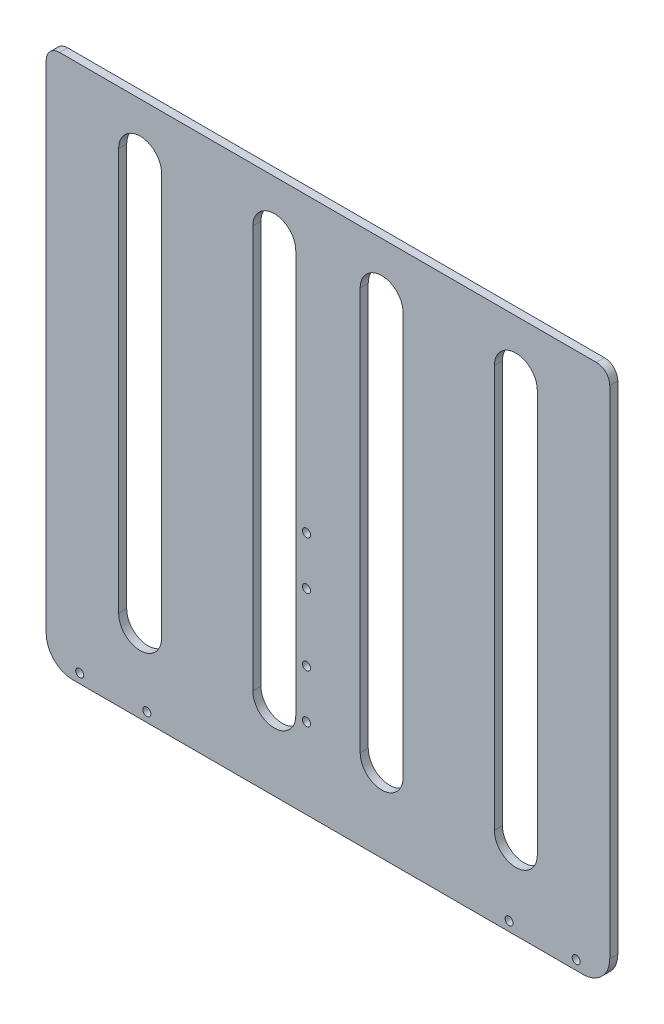
ISO-10303-21;
HEADER;
FILE_DESCRIPTION(('STEP AP214'),'2;1');
FILE_NAME('part.step','',(''),(''),'','','');
FILE_SCHEMA(('AUTOMOTIVE_DESIGN { 1 0 10303 214 1 1 1 1 }'));
ENDSEC;
DATA;
#1=APPLICATION_CONTEXT('core data for automotive mechanical design processes');
#2=APPLICATION_PROTOCOL_DEFINITION('international standard','automotive_design',2000,#1);
#3=PRODUCT_CONTEXT('',#1,'mechanical');
#4=PRODUCT('Part','Part','',(#3));
#5=PRODUCT_RELATED_PRODUCT_CATEGORY('part','',(#4));
#6=PRODUCT_DEFINITION_FORMATION('','',#4);
#7=PRODUCT_DEFINITION_CONTEXT('part definition',#1,'design');
#8=PRODUCT_DEFINITION('design','',#6,#7);
#9=PRODUCT_DEFINITION_SHAPE('','',#8);
#10=(LENGTH_UNIT() NAMED_UNIT(*) SI_UNIT(.MILLI.,.METRE.));
#11=(NAMED_UNIT(*) PLANE_ANGLE_UNIT() SI_UNIT($,.RADIAN.));
#12=(NAMED_UNIT(*) SI_UNIT($,.STERADIAN.) SOLID_ANGLE_UNIT());
#13=UNCERTAINTY_MEASURE_WITH_UNIT(LENGTH_MEASURE(1.E-05),#10,'distance_accuracy_value','');
#14=(GEOMETRIC_REPRESENTATION_CONTEXT(3) GLOBAL_UNCERTAINTY_ASSIGNED_CONTEXT((#13)) GLOBAL_UNIT_ASSIGNED_CONTEXT((#10,
#11,#12)) REPRESENTATION_CONTEXT('',''));
#15=CARTESIAN_POINT('',(0.,0.,0.));
#16=DIRECTION('',(0.,0.,1.));
#17=DIRECTION('',(1.,0.,0.));
#18=AXIS2_PLACEMENT_3D('',#15,#16,#17);
#19=CARTESIAN_POINT('',(0.,0.,3.));
#20=DIRECTION('',(1.,0.,0.));
#21=DIRECTION('',(0.,0.,-1.));
#22=AXIS2_PLACEMENT_3D('',#19,#20,#21);
#23=PLANE('',#22);
#24=DIRECTION('',(0.,-1.,0.));
#25=VECTOR('',#24,1.);
#26=CARTESIAN_POINT('',(0.,0.,3.));
#27=LINE('',#26,#25);
#28=CARTESIAN_POINT('',(0.,195.,3.));
#29=VERTEX_POINT('',#28);
#30=CARTESIAN_POINT('',(0.,10.,3.));
#31=VERTEX_POINT('',#30);
#32=EDGE_CURVE('E395',#29,#31,#27,.T.);
#33=ORIENTED_EDGE('',*,*,#32,.F.);
#34=DIRECTION('',(0.,0.,-1.));
#35=VECTOR('',#34,1.);
#36=CARTESIAN_POINT('',(0.,195.,3.));
#37=LINE('',#36,#35);
#38=CARTESIAN_POINT('',(0.,195.,0.));
#39=VERTEX_POINT('',#38);
#40=EDGE_CURVE('E11',#29,#39,#37,.T.);
#41=ORIENTED_EDGE('',*,*,#40,.T.);
#42=DIRECTION('',(0.,-1.,0.));
#43=VECTOR('',#42,1.);
#44=CARTESIAN_POINT('',(0.,0.,0.));
#45=LINE('',#44,#43);
#46=CARTESIAN_POINT('',(0.,10.,0.));
#47=VERTEX_POINT('',#46);
#48=EDGE_CURVE('E258',#39,#47,#45,.T.);
#49=ORIENTED_EDGE('',*,*,#48,.T.);
#50=DIRECTION('',(0.,0.,-1.));
#51=VECTOR('',#50,1.);
#52=CARTESIAN_POINT('',(0.,10.,3.));
#53=LINE('',#52,#51);
#54=EDGE_CURVE('E445',#47,#31,#53,.F.);
#55=ORIENTED_EDGE('',*,*,#54,.T.);
#56=EDGE_LOOP('',(#33,#41,#49,#55));
#57=FACE_BOUND('',#56,.T.);
#58=ADVANCED_FACE('F39',(#57),#23,.F.);
#59=CARTESIAN_POINT('',(0.,0.,3.));
#60=DIRECTION('',(0.,1.,0.));
#61=DIRECTION('',(0.,0.,1.));
#62=AXIS2_PLACEMENT_3D('',#59,#60,#61);
#63=PLANE('',#62);
#64=DIRECTION('',(1.,0.,0.));
#65=VECTOR('',#64,1.);
#66=CARTESIAN_POINT('',(0.,0.,0.));
#67=LINE('',#66,#65);
#68=CARTESIAN_POINT('',(10.,0.,0.));
#69=VERTEX_POINT('',#68);
#70=CARTESIAN_POINT('',(200.,0.,0.));
#71=VERTEX_POINT('',#70);
#72=EDGE_CURVE('E412',#69,#71,#67,.T.);
#73=ORIENTED_EDGE('',*,*,#72,.T.);
#74=DIRECTION('',(0.,0.,-1.));
#75=VECTOR('',#74,1.);
#76=CARTESIAN_POINT('',(200.,0.,3.));
#77=LINE('',#76,#75);
#78=CARTESIAN_POINT('',(200.,0.,3.));
#79=VERTEX_POINT('',#78);
#80=EDGE_CURVE('E436',#71,#79,#77,.F.);
#81=ORIENTED_EDGE('',*,*,#80,.T.);
#82=DIRECTION('',(1.,0.,0.));
#83=VECTOR('',#82,1.);
#84=CARTESIAN_POINT('',(0.,0.,3.));
#85=LINE('',#84,#83);
#86=CARTESIAN_POINT('',(10.,0.,3.));
#87=VERTEX_POINT('',#86);
#88=EDGE_CURVE('E398',#87,#79,#85,.T.);
#89=ORIENTED_EDGE('',*,*,#88,.F.);
#90=DIRECTION('',(0.,0.,-1.));
#91=VECTOR('',#90,1.);
#92=CARTESIAN_POINT('',(10.,0.,3.));
#93=LINE('',#92,#91);
#94=EDGE_CURVE('E432',#87,#69,#93,.T.);
#95=ORIENTED_EDGE('',*,*,#94,.T.);
#96=EDGE_LOOP('',(#73,#81,#89,#95));
#97=FACE_BOUND('',#96,.T.);
#98=ADVANCED_FACE('F486',(#97),#63,.F.);
#99=CARTESIAN_POINT('',(210.,0.,3.));
#100=DIRECTION('',(-1.,0.,0.));
#101=DIRECTION('',(0.,0.,1.));
#102=AXIS2_PLACEMENT_3D('',#99,#100,#101);
#103=PLANE('',#102);
#104=DIRECTION('',(0.,1.,0.));
#105=VECTOR('',#104,1.);
#106=CARTESIAN_POINT('',(210.,0.,0.));
#107=LINE('',#106,#105);
#108=CARTESIAN_POINT('',(210.,10.,0.));
#109=VERTEX_POINT('',#108);
#110=CARTESIAN_POINT('',(210.,195.,0.));
#111=VERTEX_POINT('',#110);
#112=EDGE_CURVE('E416',#109,#111,#107,.T.);
#113=ORIENTED_EDGE('',*,*,#112,.T.);
#114=DIRECTION('',(0.,0.,-1.));
#115=VECTOR('',#114,1.);
#116=CARTESIAN_POINT('',(210.,195.,3.));
#117=LINE('',#116,#115);
#118=CARTESIAN_POINT('',(210.,195.,3.));
#119=VERTEX_POINT('',#118);
#120=EDGE_CURVE('E63',#111,#119,#117,.F.);
#121=ORIENTED_EDGE('',*,*,#120,.T.);
#122=DIRECTION('',(0.,1.,0.));
#123=VECTOR('',#122,1.);
#124=CARTESIAN_POINT('',(210.,0.,3.));
#125=LINE('',#124,#123);
#126=CARTESIAN_POINT('',(210.,10.,3.));
#127=VERTEX_POINT('',#126);
#128=EDGE_CURVE('E403',#127,#119,#125,.T.);
#129=ORIENTED_EDGE('',*,*,#128,.F.);
#130=DIRECTION('',(0.,0.,-1.));
#131=VECTOR('',#130,1.);
#132=CARTESIAN_POINT('',(210.,10.,3.));
#133=LINE('',#132,#131);
#134=EDGE_CURVE('E409',#127,#109,#133,.T.);
#135=ORIENTED_EDGE('',*,*,#134,.T.);
#136=EDGE_LOOP('',(#113,#121,#129,#135));
#137=FACE_BOUND('',#136,.T.);
#138=ADVANCED_FACE('F478',(#137),#103,.F.);
#139=CARTESIAN_POINT('',(0.,200.,3.));
#140=DIRECTION('',(0.,-1.,0.));
#141=DIRECTION('',(0.,0.,-1.));
#142=AXIS2_PLACEMENT_3D('',#139,#140,#141);
#143=PLANE('',#142);
#144=DIRECTION('',(-1.,0.,0.));
#145=VECTOR('',#144,1.);
#146=CARTESIAN_POINT('',(0.,200.,3.));
#147=LINE('',#146,#145);
#148=CARTESIAN_POINT('',(205.,200.,3.));
#149=VERTEX_POINT('',#148);
#150=CARTESIAN_POINT('',(5.,200.,3.));
#151=VERTEX_POINT('',#150);
#152=EDGE_CURVE('E406',#149,#151,#147,.T.);
#153=ORIENTED_EDGE('',*,*,#152,.F.);
#154=DIRECTION('',(0.,0.,-1.));
#155=VECTOR('',#154,1.);
#156=CARTESIAN_POINT('',(205.,200.,3.));
#157=LINE('',#156,#155);
#158=CARTESIAN_POINT('',(205.,200.,0.));
#159=VERTEX_POINT('',#158);
#160=EDGE_CURVE('E452',#149,#159,#157,.T.);
#161=ORIENTED_EDGE('',*,*,#160,.T.);
#162=DIRECTION('',(-1.,0.,0.));
#163=VECTOR('',#162,1.);
#164=CARTESIAN_POINT('',(0.,200.,0.));
#165=LINE('',#164,#163);
#166=CARTESIAN_POINT('',(5.,200.,0.));
#167=VERTEX_POINT('',#166);
#168=EDGE_CURVE('E399',#159,#167,#165,.T.);
#169=ORIENTED_EDGE('',*,*,#168,.T.);
#170=DIRECTION('',(0.,0.,-1.));
#171=VECTOR('',#170,1.);
#172=CARTESIAN_POINT('',(5.,200.,3.));
#173=LINE('',#172,#171);
#174=EDGE_CURVE('E449',#167,#151,#173,.F.);
#175=ORIENTED_EDGE('',*,*,#174,.T.);
#176=EDGE_LOOP('',(#153,#161,#169,#175));
#177=FACE_BOUND('',#176,.T.);
#178=ADVANCED_FACE('F472',(#177),#143,.F.);
#179=CARTESIAN_POINT('',(0.,0.,3.));
#180=DIRECTION('',(0.,0.,-1.));
#181=DIRECTION('',(-1.,0.,0.));
#182=AXIS2_PLACEMENT_3D('',#179,#180,#181);
#183=PLANE('',#182);
#184=CARTESIAN_POINT('',(97.,91.,3.));
#185=DIRECTION('',(0.,0.,1.));
#186=DIRECTION('',(1.,0.,0.));
#187=AXIS2_PLACEMENT_3D('',#184,#185,#186);
#188=CIRCLE('',#187,1.5);
#189=CARTESIAN_POINT('',(98.5,91.,3.));
#190=VERTEX_POINT('',#189);
#191=EDGE_CURVE('E851',#190,#190,#188,.T.);
#192=ORIENTED_EDGE('',*,*,#191,.F.);
#193=EDGE_LOOP('',(#192));
#194=FACE_BOUND('',#193,.T.);
#195=CARTESIAN_POINT('',(97.,73.,3.));
#196=DIRECTION('',(0.,0.,1.));
#197=DIRECTION('',(1.,0.,0.));
#198=AXIS2_PLACEMENT_3D('',#195,#196,#197);
#199=CIRCLE('',#198,1.5);
#200=CARTESIAN_POINT('',(98.5,73.,3.));
#201=VERTEX_POINT('',#200);
#202=EDGE_CURVE('E855',#201,#201,#199,.T.);
#203=ORIENTED_EDGE('',*,*,#202,.F.);
#204=EDGE_LOOP('',(#203));
#205=FACE_BOUND('',#204,.T.);
#206=CARTESIAN_POINT('',(97.,30.,3.));
#207=DIRECTION('',(0.,0.,1.));
#208=DIRECTION('',(1.,0.,0.));
#209=AXIS2_PLACEMENT_3D('',#206,#207,#208);
#210=CIRCLE('',#209,1.49999999999998);
#211=CARTESIAN_POINT('',(98.5,30.,3.));
#212=VERTEX_POINT('',#211);
#213=EDGE_CURVE('E911',#212,#212,#210,.T.);
#214=ORIENTED_EDGE('',*,*,#213,.F.);
#215=EDGE_LOOP('',(#214));
#216=FACE_BOUND('',#215,.T.);
#217=CARTESIAN_POINT('',(97.,48.,3.));
#218=DIRECTION('',(0.,0.,1.));
#219=DIRECTION('',(1.,0.,0.));
#220=AXIS2_PLACEMENT_3D('',#217,#218,#219);
#221=CIRCLE('',#220,1.5);
#222=CARTESIAN_POINT('',(98.5,48.,3.));
#223=VERTEX_POINT('',#222);
#224=EDGE_CURVE('E864',#223,#223,#221,.T.);
#225=ORIENTED_EDGE('',*,*,#224,.F.);
#226=EDGE_LOOP('',(#225));
#227=FACE_BOUND('',#226,.T.);
#228=CARTESIAN_POINT('',(12.5,3.5,3.));
#229=DIRECTION('',(0.,0.,-1.));
#230=DIRECTION('',(-1.,0.,0.));
#231=AXIS2_PLACEMENT_3D('',#228,#229,#230);
#232=CIRCLE('',#231,1.5);
#233=CARTESIAN_POINT('',(11.,3.5,3.));
#234=VERTEX_POINT('',#233);
#235=EDGE_CURVE('E239',#234,#234,#232,.T.);
#236=ORIENTED_EDGE('',*,*,#235,.T.);
#237=EDGE_LOOP('',(#236));
#238=FACE_BOUND('',#237,.T.);
#239=CARTESIAN_POINT('',(37.5,3.49999999999998,3.));
#240=DIRECTION('',(0.,0.,-1.));
#241=DIRECTION('',(-1.,0.,0.));
#242=AXIS2_PLACEMENT_3D('',#239,#240,#241);
#243=CIRCLE('',#242,1.5);
#244=CARTESIAN_POINT('',(36.,3.49999999999998,3.));
#245=VERTEX_POINT('',#244);
#246=EDGE_CURVE('E891',#245,#245,#243,.T.);
#247=ORIENTED_EDGE('',*,*,#246,.T.);
#248=EDGE_LOOP('',(#247));
#249=FACE_BOUND('',#248,.T.);
#250=CARTESIAN_POINT('',(172.5,3.5,3.));
#251=DIRECTION('',(0.,0.,-1.));
#252=DIRECTION('',(-1.,0.,0.));
#253=AXIS2_PLACEMENT_3D('',#250,#251,#252);
#254=CIRCLE('',#253,1.5);
#255=CARTESIAN_POINT('',(171.,3.5,3.));
#256=VERTEX_POINT('',#255);
#257=EDGE_CURVE('E888',#256,#256,#254,.T.);
#258=ORIENTED_EDGE('',*,*,#257,.T.);
#259=EDGE_LOOP('',(#258));
#260=FACE_BOUND('',#259,.T.);
#261=CARTESIAN_POINT('',(197.5,3.50000000000001,3.));
#262=DIRECTION('',(0.,0.,-1.));
#263=DIRECTION('',(-1.,0.,0.));
#264=AXIS2_PLACEMENT_3D('',#261,#262,#263);
#265=CIRCLE('',#264,1.5);
#266=CARTESIAN_POINT('',(196.,3.50000000000001,3.));
#267=VERTEX_POINT('',#266);
#268=EDGE_CURVE('E873',#267,#267,#265,.T.);
#269=ORIENTED_EDGE('',*,*,#268,.T.);
#270=EDGE_LOOP('',(#269));
#271=FACE_BOUND('',#270,.T.);
#272=DIRECTION('',(0.,-1.,0.));
#273=VECTOR('',#272,1.);
#274=CARTESIAN_POINT('',(27.,180.,3.));
#275=LINE('',#274,#273);
#276=CARTESIAN_POINT('',(27.,180.,3.));
#277=VERTEX_POINT('',#276);
#278=CARTESIAN_POINT('',(27.,30.,3.));
#279=VERTEX_POINT('',#278);
#280=EDGE_CURVE('E248',#277,#279,#275,.T.);
#281=ORIENTED_EDGE('',*,*,#280,.F.);
#282=CARTESIAN_POINT('',(35.,180.,3.));
#283=DIRECTION('',(0.,0.,1.));
#284=DIRECTION('',(1.,0.,0.));
#285=AXIS2_PLACEMENT_3D('',#282,#283,#284);
#286=CIRCLE('',#285,8.00000000000001);
#287=CARTESIAN_POINT('',(43.,180.,3.));
#288=VERTEX_POINT('',#287);
#289=EDGE_CURVE('E211',#288,#277,#286,.T.);
#290=ORIENTED_EDGE('',*,*,#289,.F.);
#291=DIRECTION('',(0.,1.,0.));
#292=VECTOR('',#291,1.);
#293=CARTESIAN_POINT('',(43.,180.,3.));
#294=LINE('',#293,#292);
#295=CARTESIAN_POINT('',(43.,30.0000000000001,3.));
#296=VERTEX_POINT('',#295);
#297=EDGE_CURVE('E232',#296,#288,#294,.T.);
#298=ORIENTED_EDGE('',*,*,#297,.F.);
#299=CARTESIAN_POINT('',(35.,30.0000000000001,3.));
#300=DIRECTION('',(0.,0.,1.));
#301=DIRECTION('',(1.,0.,0.));
#302=AXIS2_PLACEMENT_3D('',#299,#300,#301);
#303=CIRCLE('',#302,7.99999999999999);
#304=EDGE_CURVE('E236',#279,#296,#303,.T.);
#305=ORIENTED_EDGE('',*,*,#304,.F.);
#306=EDGE_LOOP('',(#281,#290,#298,#305));
#307=FACE_BOUND('',#306,.T.);
#308=DIRECTION('',(0.,-1.,0.));
#309=VECTOR('',#308,1.);
#310=CARTESIAN_POINT('',(117.,180.,3.));
#311=LINE('',#310,#309);
#312=CARTESIAN_POINT('',(117.,180.,3.));
#313=VERTEX_POINT('',#312);
#314=CARTESIAN_POINT('',(117.,30.0000000000001,3.));
#315=VERTEX_POINT('',#314);
#316=EDGE_CURVE('E285',#313,#315,#311,.T.);
#317=ORIENTED_EDGE('',*,*,#316,.F.);
#318=CARTESIAN_POINT('',(125.,180.,3.));
#319=DIRECTION('',(0.,0.,1.));
#320=DIRECTION('',(-1.,0.,0.));
#321=AXIS2_PLACEMENT_3D('',#318,#319,#320);
#322=CIRCLE('',#321,8.00000000000001);
#323=CARTESIAN_POINT('',(133.,180.,3.));
#324=VERTEX_POINT('',#323);
#325=EDGE_CURVE('E282',#324,#313,#322,.T.);
#326=ORIENTED_EDGE('',*,*,#325,.F.);
#327=DIRECTION('',(0.,1.,0.));
#328=VECTOR('',#327,1.);
#329=CARTESIAN_POINT('',(133.,180.,3.));
#330=LINE('',#329,#328);
#331=CARTESIAN_POINT('',(133.,30.0000000000001,3.));
#332=VERTEX_POINT('',#331);
#333=EDGE_CURVE('E269',#332,#324,#330,.T.);
#334=ORIENTED_EDGE('',*,*,#333,.F.);
#335=CARTESIAN_POINT('',(125.,30.0000000000001,3.));
#336=DIRECTION('',(0.,0.,1.));
#337=DIRECTION('',(-1.,0.,0.));
#338=AXIS2_PLACEMENT_3D('',#335,#336,#337);
#339=CIRCLE('',#338,8.00000000000001);
#340=EDGE_CURVE('E289',#315,#332,#339,.T.);
#341=ORIENTED_EDGE('',*,*,#340,.F.);
#342=EDGE_LOOP('',(#317,#326,#334,#341));
#343=FACE_BOUND('',#342,.T.);
#344=DIRECTION('',(0.,-1.,0.));
#345=VECTOR('',#344,1.);
#346=CARTESIAN_POINT('',(77.,180.,3.));
#347=LINE('',#346,#345);
#348=CARTESIAN_POINT('',(77.,180.,3.));
#349=VERTEX_POINT('',#348);
#350=CARTESIAN_POINT('',(77.,30.0000000000001,3.));
#351=VERTEX_POINT('',#350);
#352=EDGE_CURVE('E373',#349,#351,#347,.T.);
#353=ORIENTED_EDGE('',*,*,#352,.F.);
#354=CARTESIAN_POINT('',(85.,180.,3.));
#355=DIRECTION('',(0.,0.,1.));
#356=DIRECTION('',(1.,0.,0.));
#357=AXIS2_PLACEMENT_3D('',#354,#355,#356);
#358=CIRCLE('',#357,8.00000000000001);
#359=CARTESIAN_POINT('',(93.,180.,3.));
#360=VERTEX_POINT('',#359);
#361=EDGE_CURVE('E299',#360,#349,#358,.T.);
#362=ORIENTED_EDGE('',*,*,#361,.F.);
#363=DIRECTION('',(0.,1.,0.));
#364=VECTOR('',#363,1.);
#365=CARTESIAN_POINT('',(93.,180.,3.));
#366=LINE('',#365,#364);
#367=CARTESIAN_POINT('',(93.,30.0000000000001,3.));
#368=VERTEX_POINT('',#367);
#369=EDGE_CURVE('E358',#368,#360,#366,.T.);
#370=ORIENTED_EDGE('',*,*,#369,.F.);
#371=CARTESIAN_POINT('',(85.,30.0000000000001,3.));
#372=DIRECTION('',(0.,0.,1.));
#373=DIRECTION('',(1.,0.,0.));
#374=AXIS2_PLACEMENT_3D('',#371,#372,#373);
#375=CIRCLE('',#374,8.00000000000001);
#376=EDGE_CURVE('E377',#351,#368,#375,.T.);
#377=ORIENTED_EDGE('',*,*,#376,.F.);
#378=EDGE_LOOP('',(#353,#362,#370,#377));
#379=FACE_BOUND('',#378,.T.);
#380=DIRECTION('',(0.,-1.,0.));
#381=VECTOR('',#380,1.);
#382=CARTESIAN_POINT('',(167.,180.,3.));
#383=LINE('',#382,#381);
#384=CARTESIAN_POINT('',(167.,180.,3.));
#385=VERTEX_POINT('',#384);
#386=CARTESIAN_POINT('',(167.,30.0000000000001,3.));
#387=VERTEX_POINT('',#386);
#388=EDGE_CURVE('E330',#385,#387,#383,.T.);
#389=ORIENTED_EDGE('',*,*,#388,.F.);
#390=CARTESIAN_POINT('',(175.,180.,3.));
#391=DIRECTION('',(0.,0.,1.));
#392=DIRECTION('',(-1.,0.,0.));
#393=AXIS2_PLACEMENT_3D('',#390,#391,#392);
#394=CIRCLE('',#393,8.00000000000001);
#395=CARTESIAN_POINT('',(183.,180.,3.));
#396=VERTEX_POINT('',#395);
#397=EDGE_CURVE('E327',#396,#385,#394,.T.);
#398=ORIENTED_EDGE('',*,*,#397,.F.);
#399=DIRECTION('',(0.,1.,0.));
#400=VECTOR('',#399,1.);
#401=CARTESIAN_POINT('',(183.,180.,3.));
#402=LINE('',#401,#400);
#403=CARTESIAN_POINT('',(183.,30.0000000000001,3.));
#404=VERTEX_POINT('',#403);
#405=EDGE_CURVE('E314',#404,#396,#402,.T.);
#406=ORIENTED_EDGE('',*,*,#405,.F.);
#407=CARTESIAN_POINT('',(175.,30.0000000000001,3.));
#408=DIRECTION('',(0.,0.,1.));
#409=DIRECTION('',(-1.,0.,0.));
#410=AXIS2_PLACEMENT_3D('',#407,#408,#409);
#411=CIRCLE('',#410,7.99999999999999);
#412=EDGE_CURVE('E335',#387,#404,#411,.T.);
#413=ORIENTED_EDGE('',*,*,#412,.F.);
#414=EDGE_LOOP('',(#389,#398,#406,#413));
#415=FACE_BOUND('',#414,.T.);
#416=ORIENTED_EDGE('',*,*,#128,.T.);
#417=CARTESIAN_POINT('',(205.,195.,3.));
#418=DIRECTION('',(0.,0.,-1.));
#419=DIRECTION('',(-1.,0.,0.));
#420=AXIS2_PLACEMENT_3D('',#417,#418,#419);
#421=CIRCLE('',#420,5.);
#422=EDGE_CURVE('E48',#119,#149,#421,.F.);
#423=ORIENTED_EDGE('',*,*,#422,.T.);
#424=ORIENTED_EDGE('',*,*,#152,.T.);
#425=CARTESIAN_POINT('',(5.,195.,3.));
#426=DIRECTION('',(0.,0.,-1.));
#427=DIRECTION('',(-1.,0.,0.));
#428=AXIS2_PLACEMENT_3D('',#425,#426,#427);
#429=CIRCLE('',#428,5.);
#430=EDGE_CURVE('E55',#151,#29,#429,.F.);
#431=ORIENTED_EDGE('',*,*,#430,.T.);
#432=ORIENTED_EDGE('',*,*,#32,.T.);
#433=CARTESIAN_POINT('',(10.,10.,3.));
#434=DIRECTION('',(0.,0.,-1.));
#435=DIRECTION('',(-1.,0.,0.));
#436=AXIS2_PLACEMENT_3D('',#433,#434,#435);
#437=CIRCLE('',#436,10.);
#438=EDGE_CURVE('E439',#31,#87,#437,.F.);
#439=ORIENTED_EDGE('',*,*,#438,.T.);
#440=ORIENTED_EDGE('',*,*,#88,.T.);
#441=CARTESIAN_POINT('',(200.,10.,3.));
#442=DIRECTION('',(0.,0.,-1.));
#443=DIRECTION('',(-1.,0.,0.));
#444=AXIS2_PLACEMENT_3D('',#441,#442,#443);
#445=CIRCLE('',#444,10.);
#446=EDGE_CURVE('E442',#79,#127,#445,.F.);
#447=ORIENTED_EDGE('',*,*,#446,.T.);
#448=EDGE_LOOP('',(#416,#423,#424,#431,#432,#439,#440,#447));
#449=FACE_BOUND('',#448,.T.);
#450=ADVANCED_FACE('F468',(#194,#205,#216,#227,#238,#249,#260,#271,#307,#343,#379,#415,#449),
#183,.F.);
#451=CARTESIAN_POINT('',(0.,0.,0.));
#452=DIRECTION('',(0.,0.,-1.));
#453=DIRECTION('',(-1.,0.,0.));
#454=AXIS2_PLACEMENT_3D('',#451,#452,#453);
#455=PLANE('',#454);
#456=CARTESIAN_POINT('',(97.,91.,0.));
#457=DIRECTION('',(0.,0.,1.));
#458=DIRECTION('',(1.,0.,0.));
#459=AXIS2_PLACEMENT_3D('',#456,#457,#458);
#460=CIRCLE('',#459,1.5);
#461=CARTESIAN_POINT('',(98.5,91.,0.));
#462=VERTEX_POINT('',#461);
#463=EDGE_CURVE('E848',#462,#462,#460,.T.);
#464=ORIENTED_EDGE('',*,*,#463,.T.);
#465=EDGE_LOOP('',(#464));
#466=FACE_BOUND('',#465,.T.);
#467=CARTESIAN_POINT('',(97.,73.,0.));
#468=DIRECTION('',(0.,0.,1.));
#469=DIRECTION('',(1.,0.,0.));
#470=AXIS2_PLACEMENT_3D('',#467,#468,#469);
#471=CIRCLE('',#470,1.5);
#472=CARTESIAN_POINT('',(98.5,73.,0.));
#473=VERTEX_POINT('',#472);
#474=EDGE_CURVE('E915',#473,#473,#471,.T.);
#475=ORIENTED_EDGE('',*,*,#474,.T.);
#476=EDGE_LOOP('',(#475));
#477=FACE_BOUND('',#476,.T.);
#478=CARTESIAN_POINT('',(97.,30.,0.));
#479=DIRECTION('',(0.,0.,1.));
#480=DIRECTION('',(1.,0.,0.));
#481=AXIS2_PLACEMENT_3D('',#478,#479,#480);
#482=CIRCLE('',#481,1.49999999999998);
#483=CARTESIAN_POINT('',(98.5,30.,0.));
#484=VERTEX_POINT('',#483);
#485=EDGE_CURVE('E868',#484,#484,#482,.T.);
#486=ORIENTED_EDGE('',*,*,#485,.T.);
#487=EDGE_LOOP('',(#486));
#488=FACE_BOUND('',#487,.T.);
#489=CARTESIAN_POINT('',(97.,48.,0.));
#490=DIRECTION('',(0.,0.,1.));
#491=DIRECTION('',(1.,0.,0.));
#492=AXIS2_PLACEMENT_3D('',#489,#490,#491);
#493=CIRCLE('',#492,1.5);
#494=CARTESIAN_POINT('',(98.5,48.,0.));
#495=VERTEX_POINT('',#494);
#496=EDGE_CURVE('E859',#495,#495,#493,.T.);
#497=ORIENTED_EDGE('',*,*,#496,.T.);
#498=EDGE_LOOP('',(#497));
#499=FACE_BOUND('',#498,.T.);
#500=CARTESIAN_POINT('',(12.5,3.5,0.));
#501=DIRECTION('',(0.,0.,1.));
#502=DIRECTION('',(1.,0.,0.));
#503=AXIS2_PLACEMENT_3D('',#500,#501,#502);
#504=CIRCLE('',#503,1.5);
#505=CARTESIAN_POINT('',(14.,3.5,0.));
#506=VERTEX_POINT('',#505);
#507=EDGE_CURVE('E869',#506,#506,#504,.T.);
#508=ORIENTED_EDGE('',*,*,#507,.T.);
#509=EDGE_LOOP('',(#508));
#510=FACE_BOUND('',#509,.T.);
#511=CARTESIAN_POINT('',(37.5,3.49999999999998,0.));
#512=DIRECTION('',(0.,0.,1.));
#513=DIRECTION('',(1.,0.,0.));
#514=AXIS2_PLACEMENT_3D('',#511,#512,#513);
#515=CIRCLE('',#514,1.5);
#516=CARTESIAN_POINT('',(39.,3.49999999999998,0.));
#517=VERTEX_POINT('',#516);
#518=EDGE_CURVE('E874',#517,#517,#515,.T.);
#519=ORIENTED_EDGE('',*,*,#518,.T.);
#520=EDGE_LOOP('',(#519));
#521=FACE_BOUND('',#520,.T.);
#522=CARTESIAN_POINT('',(172.5,3.5,0.));
#523=DIRECTION('',(0.,0.,1.));
#524=DIRECTION('',(-1.,0.,0.));
#525=AXIS2_PLACEMENT_3D('',#522,#523,#524);
#526=CIRCLE('',#525,1.5);
#527=CARTESIAN_POINT('',(171.,3.5,0.));
#528=VERTEX_POINT('',#527);
#529=EDGE_CURVE('E878',#528,#528,#526,.T.);
#530=ORIENTED_EDGE('',*,*,#529,.T.);
#531=EDGE_LOOP('',(#530));
#532=FACE_BOUND('',#531,.T.);
#533=CARTESIAN_POINT('',(197.5,3.50000000000001,0.));
#534=DIRECTION('',(0.,0.,1.));
#535=DIRECTION('',(-1.,0.,0.));
#536=AXIS2_PLACEMENT_3D('',#533,#534,#535);
#537=CIRCLE('',#536,1.5);
#538=CARTESIAN_POINT('',(196.,3.50000000000001,0.));
#539=VERTEX_POINT('',#538);
#540=EDGE_CURVE('E863',#539,#539,#537,.T.);
#541=ORIENTED_EDGE('',*,*,#540,.T.);
#542=EDGE_LOOP('',(#541));
#543=FACE_BOUND('',#542,.T.);
#544=CARTESIAN_POINT('',(35.,180.,0.));
#545=DIRECTION('',(0.,0.,1.));
#546=DIRECTION('',(1.,0.,0.));
#547=AXIS2_PLACEMENT_3D('',#544,#545,#546);
#548=CIRCLE('',#547,8.00000000000001);
#549=CARTESIAN_POINT('',(43.,180.,0.));
#550=VERTEX_POINT('',#549);
#551=CARTESIAN_POINT('',(27.,180.,0.));
#552=VERTEX_POINT('',#551);
#553=EDGE_CURVE('E208',#550,#552,#548,.T.);
#554=ORIENTED_EDGE('',*,*,#553,.T.);
#555=DIRECTION('',(0.,-1.,0.));
#556=VECTOR('',#555,1.);
#557=CARTESIAN_POINT('',(27.,180.,0.));
#558=LINE('',#557,#556);
#559=CARTESIAN_POINT('',(27.0000000000001,30.,0.));
#560=VERTEX_POINT('',#559);
#561=EDGE_CURVE('E221',#552,#560,#558,.T.);
#562=ORIENTED_EDGE('',*,*,#561,.T.);
#563=CARTESIAN_POINT('',(35.,30.0000000000001,0.));
#564=DIRECTION('',(0.,0.,1.));
#565=DIRECTION('',(1.,0.,0.));
#566=AXIS2_PLACEMENT_3D('',#563,#564,#565);
#567=CIRCLE('',#566,7.99999999999999);
#568=CARTESIAN_POINT('',(43.,30.0000000000001,0.));
#569=VERTEX_POINT('',#568);
#570=EDGE_CURVE('E226',#560,#569,#567,.T.);
#571=ORIENTED_EDGE('',*,*,#570,.T.);
#572=DIRECTION('',(0.,1.,0.));
#573=VECTOR('',#572,1.);
#574=CARTESIAN_POINT('',(43.,180.,0.));
#575=LINE('',#574,#573);
#576=EDGE_CURVE('E217',#569,#550,#575,.T.);
#577=ORIENTED_EDGE('',*,*,#576,.T.);
#578=EDGE_LOOP('',(#554,#562,#571,#577));
#579=FACE_BOUND('',#578,.T.);
#580=CARTESIAN_POINT('',(125.,180.,0.));
#581=DIRECTION('',(0.,0.,1.));
#582=DIRECTION('',(-1.,0.,0.));
#583=AXIS2_PLACEMENT_3D('',#580,#581,#582);
#584=CIRCLE('',#583,8.00000000000001);
#585=CARTESIAN_POINT('',(133.,180.,0.));
#586=VERTEX_POINT('',#585);
#587=CARTESIAN_POINT('',(117.,180.,0.));
#588=VERTEX_POINT('',#587);
#589=EDGE_CURVE('E264',#586,#588,#584,.T.);
#590=ORIENTED_EDGE('',*,*,#589,.T.);
#591=DIRECTION('',(0.,-1.,0.));
#592=VECTOR('',#591,1.);
#593=CARTESIAN_POINT('',(117.,180.,0.));
#594=LINE('',#593,#592);
#595=CARTESIAN_POINT('',(117.,30.0000000000001,0.));
#596=VERTEX_POINT('',#595);
#597=EDGE_CURVE('E268',#588,#596,#594,.T.);
#598=ORIENTED_EDGE('',*,*,#597,.T.);
#599=CARTESIAN_POINT('',(125.,30.0000000000001,0.));
#600=DIRECTION('',(0.,0.,1.));
#601=DIRECTION('',(-1.,0.,0.));
#602=AXIS2_PLACEMENT_3D('',#599,#600,#601);
#603=CIRCLE('',#602,8.00000000000001);
#604=CARTESIAN_POINT('',(133.,30.0000000000001,0.));
#605=VERTEX_POINT('',#604);
#606=EDGE_CURVE('E273',#596,#605,#603,.T.);
#607=ORIENTED_EDGE('',*,*,#606,.T.);
#608=DIRECTION('',(0.,1.,0.));
#609=VECTOR('',#608,1.);
#610=CARTESIAN_POINT('',(133.,180.,0.));
#611=LINE('',#610,#609);
#612=EDGE_CURVE('E277',#605,#586,#611,.T.);
#613=ORIENTED_EDGE('',*,*,#612,.T.);
#614=EDGE_LOOP('',(#590,#598,#607,#613));
#615=FACE_BOUND('',#614,.T.);
#616=CARTESIAN_POINT('',(85.,180.,0.));
#617=DIRECTION('',(0.,0.,1.));
#618=DIRECTION('',(1.,0.,0.));
#619=AXIS2_PLACEMENT_3D('',#616,#617,#618);
#620=CIRCLE('',#619,8.00000000000001);
#621=CARTESIAN_POINT('',(93.,180.,0.));
#622=VERTEX_POINT('',#621);
#623=CARTESIAN_POINT('',(77.,180.,0.));
#624=VERTEX_POINT('',#623);
#625=EDGE_CURVE('E353',#622,#624,#620,.T.);
#626=ORIENTED_EDGE('',*,*,#625,.T.);
#627=DIRECTION('',(0.,-1.,0.));
#628=VECTOR('',#627,1.);
#629=CARTESIAN_POINT('',(77.,180.,0.));
#630=LINE('',#629,#628);
#631=CARTESIAN_POINT('',(77.,30.0000000000001,0.));
#632=VERTEX_POINT('',#631);
#633=EDGE_CURVE('E357',#624,#632,#630,.T.);
#634=ORIENTED_EDGE('',*,*,#633,.T.);
#635=CARTESIAN_POINT('',(85.,30.0000000000001,0.));
#636=DIRECTION('',(0.,0.,1.));
#637=DIRECTION('',(1.,0.,0.));
#638=AXIS2_PLACEMENT_3D('',#635,#636,#637);
#639=CIRCLE('',#638,8.00000000000001);
#640=CARTESIAN_POINT('',(93.,30.0000000000001,0.));
#641=VERTEX_POINT('',#640);
#642=EDGE_CURVE('E362',#632,#641,#639,.T.);
#643=ORIENTED_EDGE('',*,*,#642,.T.);
#644=DIRECTION('',(0.,1.,0.));
#645=VECTOR('',#644,1.);
#646=CARTESIAN_POINT('',(93.,180.,0.));
#647=LINE('',#646,#645);
#648=EDGE_CURVE('E366',#641,#622,#647,.T.);
#649=ORIENTED_EDGE('',*,*,#648,.T.);
#650=EDGE_LOOP('',(#626,#634,#643,#649));
#651=FACE_BOUND('',#650,.T.);
#652=CARTESIAN_POINT('',(175.,180.,0.));
#653=DIRECTION('',(0.,0.,1.));
#654=DIRECTION('',(-1.,0.,0.));
#655=AXIS2_PLACEMENT_3D('',#652,#653,#654);
#656=CIRCLE('',#655,8.00000000000001);
#657=CARTESIAN_POINT('',(183.,180.,0.));
#658=VERTEX_POINT('',#657);
#659=CARTESIAN_POINT('',(167.,180.,0.));
#660=VERTEX_POINT('',#659);
#661=EDGE_CURVE('E309',#658,#660,#656,.T.);
#662=ORIENTED_EDGE('',*,*,#661,.T.);
#663=DIRECTION('',(0.,-1.,0.));
#664=VECTOR('',#663,1.);
#665=CARTESIAN_POINT('',(167.,180.,0.));
#666=LINE('',#665,#664);
#667=CARTESIAN_POINT('',(167.,30.0000000000001,0.));
#668=VERTEX_POINT('',#667);
#669=EDGE_CURVE('E313',#660,#668,#666,.T.);
#670=ORIENTED_EDGE('',*,*,#669,.T.);
#671=CARTESIAN_POINT('',(175.,30.0000000000001,0.));
#672=DIRECTION('',(0.,0.,1.));
#673=DIRECTION('',(-1.,0.,0.));
#674=AXIS2_PLACEMENT_3D('',#671,#672,#673);
#675=CIRCLE('',#674,7.99999999999999);
#676=CARTESIAN_POINT('',(183.,30.0000000000001,0.));
#677=VERTEX_POINT('',#676);
#678=EDGE_CURVE('E318',#668,#677,#675,.T.);
#679=ORIENTED_EDGE('',*,*,#678,.T.);
#680=DIRECTION('',(0.,1.,0.));
#681=VECTOR('',#680,1.);
#682=CARTESIAN_POINT('',(183.,180.,0.));
#683=LINE('',#682,#681);
#684=EDGE_CURVE('E322',#677,#658,#683,.T.);
#685=ORIENTED_EDGE('',*,*,#684,.T.);
#686=EDGE_LOOP('',(#662,#670,#679,#685));
#687=FACE_BOUND('',#686,.T.);
#688=ORIENTED_EDGE('',*,*,#168,.F.);
#689=CARTESIAN_POINT('',(205.,195.,0.));
#690=DIRECTION('',(0.,0.,-1.));
#691=DIRECTION('',(-1.,0.,0.));
#692=AXIS2_PLACEMENT_3D('',#689,#690,#691);
#693=CIRCLE('',#692,5.);
#694=EDGE_CURVE('E459',#159,#111,#693,.T.);
#695=ORIENTED_EDGE('',*,*,#694,.T.);
#696=ORIENTED_EDGE('',*,*,#112,.F.);
#697=CARTESIAN_POINT('',(200.,10.,0.));
#698=DIRECTION('',(0.,0.,-1.));
#699=DIRECTION('',(-1.,0.,0.));
#700=AXIS2_PLACEMENT_3D('',#697,#698,#699);
#701=CIRCLE('',#700,10.);
#702=EDGE_CURVE('E429',#109,#71,#701,.T.);
#703=ORIENTED_EDGE('',*,*,#702,.T.);
#704=ORIENTED_EDGE('',*,*,#72,.F.);
#705=CARTESIAN_POINT('',(10.,10.,0.));
#706=DIRECTION('',(0.,0.,-1.));
#707=DIRECTION('',(-1.,0.,0.));
#708=AXIS2_PLACEMENT_3D('',#705,#706,#707);
#709=CIRCLE('',#708,10.);
#710=EDGE_CURVE('E425',#69,#47,#709,.T.);
#711=ORIENTED_EDGE('',*,*,#710,.T.);
#712=ORIENTED_EDGE('',*,*,#48,.F.);
#713=CARTESIAN_POINT('',(5.,195.,0.));
#714=DIRECTION('',(0.,0.,-1.));
#715=DIRECTION('',(-1.,0.,0.));
#716=AXIS2_PLACEMENT_3D('',#713,#714,#715);
#717=CIRCLE('',#716,5.);
#718=EDGE_CURVE('E456',#39,#167,#717,.T.);
#719=ORIENTED_EDGE('',*,*,#718,.T.);
#720=EDGE_LOOP('',(#688,#695,#696,#703,#704,#711,#712,#719));
#721=FACE_BOUND('',#720,.T.);
#722=ADVANCED_FACE('F228',(#466,#477,#488,#499,#510,#521,#532,#543,#579,#615,#651,#687,#721),
#455,.T.);
#723=CARTESIAN_POINT('',(175.,180.,0.));
#724=DIRECTION('',(0.,0.,1.));
#725=DIRECTION('',(1.,0.,0.));
#726=AXIS2_PLACEMENT_3D('',#723,#724,#725);
#727=CYLINDRICAL_SURFACE('',#726,8.00000000000001);
#728=ORIENTED_EDGE('',*,*,#397,.T.);
#729=DIRECTION('',(0.,0.,1.));
#730=VECTOR('',#729,1.);
#731=CARTESIAN_POINT('',(167.,180.,0.));
#732=LINE('',#731,#730);
#733=EDGE_CURVE('E326',#660,#385,#732,.T.);
#734=ORIENTED_EDGE('',*,*,#733,.F.);
#735=ORIENTED_EDGE('',*,*,#661,.F.);
#736=DIRECTION('',(0.,0.,1.));
#737=VECTOR('',#736,1.);
#738=CARTESIAN_POINT('',(183.,180.,0.));
#739=LINE('',#738,#737);
#740=EDGE_CURVE('E249',#658,#396,#739,.T.);
#741=ORIENTED_EDGE('',*,*,#740,.T.);
#742=EDGE_LOOP('',(#728,#734,#735,#741));
#743=FACE_BOUND('',#742,.T.);
#744=ADVANCED_FACE('F591',(#743),#727,.F.);
#745=CARTESIAN_POINT('',(183.,180.,0.));
#746=DIRECTION('',(1.,0.,0.));
#747=DIRECTION('',(0.,0.,-1.));
#748=AXIS2_PLACEMENT_3D('',#745,#746,#747);
#749=PLANE('',#748);
#750=ORIENTED_EDGE('',*,*,#405,.T.);
#751=ORIENTED_EDGE('',*,*,#740,.F.);
#752=ORIENTED_EDGE('',*,*,#684,.F.);
#753=DIRECTION('',(0.,0.,1.));
#754=VECTOR('',#753,1.);
#755=CARTESIAN_POINT('',(183.,30.0000000000001,0.));
#756=LINE('',#755,#754);
#757=EDGE_CURVE('E344',#677,#404,#756,.T.);
#758=ORIENTED_EDGE('',*,*,#757,.T.);
#759=EDGE_LOOP('',(#750,#751,#752,#758));
#760=FACE_BOUND('',#759,.T.);
#761=ADVANCED_FACE('F666',(#760),#749,.F.);
#762=CARTESIAN_POINT('',(175.,30.0000000000001,0.));
#763=DIRECTION('',(0.,0.,1.));
#764=DIRECTION('',(1.,0.,0.));
#765=AXIS2_PLACEMENT_3D('',#762,#763,#764);
#766=CYLINDRICAL_SURFACE('',#765,7.99999999999999);
#767=ORIENTED_EDGE('',*,*,#412,.T.);
#768=ORIENTED_EDGE('',*,*,#757,.F.);
#769=ORIENTED_EDGE('',*,*,#678,.F.);
#770=DIRECTION('',(0.,0.,1.));
#771=VECTOR('',#770,1.);
#772=CARTESIAN_POINT('',(167.,30.0000000000001,0.));
#773=LINE('',#772,#771);
#774=EDGE_CURVE('E347',#668,#387,#773,.T.);
#775=ORIENTED_EDGE('',*,*,#774,.T.);
#776=EDGE_LOOP('',(#767,#768,#769,#775));
#777=FACE_BOUND('',#776,.T.);
#778=ADVANCED_FACE('F669',(#777),#766,.F.);
#779=CARTESIAN_POINT('',(167.,180.,0.));
#780=DIRECTION('',(-1.,0.,0.));
#781=DIRECTION('',(0.,-1.,0.));
#782=AXIS2_PLACEMENT_3D('',#779,#780,#781);
#783=PLANE('',#782);
#784=ORIENTED_EDGE('',*,*,#388,.T.);
#785=ORIENTED_EDGE('',*,*,#774,.F.);
#786=ORIENTED_EDGE('',*,*,#669,.F.);
#787=ORIENTED_EDGE('',*,*,#733,.T.);
#788=EDGE_LOOP('',(#784,#785,#786,#787));
#789=FACE_BOUND('',#788,.T.);
#790=ADVANCED_FACE('F673',(#789),#783,.F.);
#791=CARTESIAN_POINT('',(85.,180.,0.));
#792=DIRECTION('',(0.,0.,1.));
#793=DIRECTION('',(1.,0.,0.));
#794=AXIS2_PLACEMENT_3D('',#791,#792,#793);
#795=CYLINDRICAL_SURFACE('',#794,8.00000000000001);
#796=ORIENTED_EDGE('',*,*,#361,.T.);
#797=DIRECTION('',(0.,0.,1.));
#798=VECTOR('',#797,1.);
#799=CARTESIAN_POINT('',(77.,180.,0.));
#800=LINE('',#799,#798);
#801=EDGE_CURVE('E370',#624,#349,#800,.T.);
#802=ORIENTED_EDGE('',*,*,#801,.F.);
#803=ORIENTED_EDGE('',*,*,#625,.F.);
#804=DIRECTION('',(0.,0.,1.));
#805=VECTOR('',#804,1.);
#806=CARTESIAN_POINT('',(93.,180.,0.));
#807=LINE('',#806,#805);
#808=EDGE_CURVE('E331',#622,#360,#807,.T.);
#809=ORIENTED_EDGE('',*,*,#808,.T.);
#810=EDGE_LOOP('',(#796,#802,#803,#809));
#811=FACE_BOUND('',#810,.T.);
#812=ADVANCED_FACE('F677',(#811),#795,.F.);
#813=CARTESIAN_POINT('',(93.,180.,0.));
#814=DIRECTION('',(1.,0.,0.));
#815=DIRECTION('',(0.,1.,0.));
#816=AXIS2_PLACEMENT_3D('',#813,#814,#815);
#817=PLANE('',#816);
#818=ORIENTED_EDGE('',*,*,#369,.T.);
#819=ORIENTED_EDGE('',*,*,#808,.F.);
#820=ORIENTED_EDGE('',*,*,#648,.F.);
#821=DIRECTION('',(0.,0.,1.));
#822=VECTOR('',#821,1.);
#823=CARTESIAN_POINT('',(93.,30.0000000000001,0.));
#824=LINE('',#823,#822);
#825=EDGE_CURVE('E386',#641,#368,#824,.T.);
#826=ORIENTED_EDGE('',*,*,#825,.T.);
#827=EDGE_LOOP('',(#818,#819,#820,#826));
#828=FACE_BOUND('',#827,.T.);
#829=ADVANCED_FACE('F681',(#828),#817,.F.);
#830=CARTESIAN_POINT('',(85.,30.0000000000001,0.));
#831=DIRECTION('',(0.,0.,1.));
#832=DIRECTION('',(1.,0.,0.));
#833=AXIS2_PLACEMENT_3D('',#830,#831,#832);
#834=CYLINDRICAL_SURFACE('',#833,8.00000000000001);
#835=ORIENTED_EDGE('',*,*,#376,.T.);
#836=ORIENTED_EDGE('',*,*,#825,.F.);
#837=ORIENTED_EDGE('',*,*,#642,.F.);
#838=DIRECTION('',(0.,0.,1.));
#839=VECTOR('',#838,1.);
#840=CARTESIAN_POINT('',(77.,30.0000000000001,0.));
#841=LINE('',#840,#839);
#842=EDGE_CURVE('E389',#632,#351,#841,.T.);
#843=ORIENTED_EDGE('',*,*,#842,.T.);
#844=EDGE_LOOP('',(#835,#836,#837,#843));
#845=FACE_BOUND('',#844,.T.);
#846=ADVANCED_FACE('F684',(#845),#834,.F.);
#847=CARTESIAN_POINT('',(77.,180.,0.));
#848=DIRECTION('',(-1.,0.,0.));
#849=DIRECTION('',(0.,-1.,0.));
#850=AXIS2_PLACEMENT_3D('',#847,#848,#849);
#851=PLANE('',#850);
#852=ORIENTED_EDGE('',*,*,#352,.T.);
#853=ORIENTED_EDGE('',*,*,#842,.F.);
#854=ORIENTED_EDGE('',*,*,#633,.F.);
#855=ORIENTED_EDGE('',*,*,#801,.T.);
#856=EDGE_LOOP('',(#852,#853,#854,#855));
#857=FACE_BOUND('',#856,.T.);
#858=ADVANCED_FACE('F664',(#857),#851,.F.);
#859=CARTESIAN_POINT('',(125.,180.,0.));
#860=DIRECTION('',(0.,0.,1.));
#861=DIRECTION('',(1.,0.,0.));
#862=AXIS2_PLACEMENT_3D('',#859,#860,#861);
#863=CYLINDRICAL_SURFACE('',#862,8.00000000000001);
#864=ORIENTED_EDGE('',*,*,#325,.T.);
#865=DIRECTION('',(0.,0.,1.));
#866=VECTOR('',#865,1.);
#867=CARTESIAN_POINT('',(117.,180.,0.));
#868=LINE('',#867,#866);
#869=EDGE_CURVE('E281',#588,#313,#868,.T.);
#870=ORIENTED_EDGE('',*,*,#869,.F.);
#871=ORIENTED_EDGE('',*,*,#589,.F.);
#872=DIRECTION('',(0.,0.,1.));
#873=VECTOR('',#872,1.);
#874=CARTESIAN_POINT('',(133.,180.,0.));
#875=LINE('',#874,#873);
#876=EDGE_CURVE('E296',#586,#324,#875,.T.);
#877=ORIENTED_EDGE('',*,*,#876,.T.);
#878=EDGE_LOOP('',(#864,#870,#871,#877));
#879=FACE_BOUND('',#878,.T.);
#880=ADVANCED_FACE('F654',(#879),#863,.F.);
#881=CARTESIAN_POINT('',(133.,180.,0.));
#882=DIRECTION('',(1.,0.,0.));
#883=DIRECTION('',(0.,1.,0.));
#884=AXIS2_PLACEMENT_3D('',#881,#882,#883);
#885=PLANE('',#884);
#886=ORIENTED_EDGE('',*,*,#333,.T.);
#887=ORIENTED_EDGE('',*,*,#876,.F.);
#888=ORIENTED_EDGE('',*,*,#612,.F.);
#889=DIRECTION('',(0.,0.,1.));
#890=VECTOR('',#889,1.);
#891=CARTESIAN_POINT('',(133.,30.0000000000001,0.));
#892=LINE('',#891,#890);
#893=EDGE_CURVE('E300',#605,#332,#892,.T.);
#894=ORIENTED_EDGE('',*,*,#893,.T.);
#895=EDGE_LOOP('',(#886,#887,#888,#894));
#896=FACE_BOUND('',#895,.T.);
#897=ADVANCED_FACE('F650',(#896),#885,.F.);
#898=CARTESIAN_POINT('',(125.,30.0000000000001,0.));
#899=DIRECTION('',(0.,0.,1.));
#900=DIRECTION('',(1.,0.,0.));
#901=AXIS2_PLACEMENT_3D('',#898,#899,#900);
#902=CYLINDRICAL_SURFACE('',#901,8.00000000000001);
#903=ORIENTED_EDGE('',*,*,#340,.T.);
#904=ORIENTED_EDGE('',*,*,#893,.F.);
#905=ORIENTED_EDGE('',*,*,#606,.F.);
#906=DIRECTION('',(0.,0.,1.));
#907=VECTOR('',#906,1.);
#908=CARTESIAN_POINT('',(117.,30.0000000000001,0.));
#909=LINE('',#908,#907);
#910=EDGE_CURVE('E303',#596,#315,#909,.T.);
#911=ORIENTED_EDGE('',*,*,#910,.T.);
#912=EDGE_LOOP('',(#903,#904,#905,#911));
#913=FACE_BOUND('',#912,.T.);
#914=ADVANCED_FACE('F653',(#913),#902,.F.);
#915=CARTESIAN_POINT('',(117.,180.,0.));
#916=DIRECTION('',(-1.,0.,0.));
#917=DIRECTION('',(0.,-1.,0.));
#918=AXIS2_PLACEMENT_3D('',#915,#916,#917);
#919=PLANE('',#918);
#920=ORIENTED_EDGE('',*,*,#316,.T.);
#921=ORIENTED_EDGE('',*,*,#910,.F.);
#922=ORIENTED_EDGE('',*,*,#597,.F.);
#923=ORIENTED_EDGE('',*,*,#869,.T.);
#924=EDGE_LOOP('',(#920,#921,#922,#923));
#925=FACE_BOUND('',#924,.T.);
#926=ADVANCED_FACE('F649',(#925),#919,.F.);
#927=CARTESIAN_POINT('',(35.,180.,0.));
#928=DIRECTION('',(0.,0.,1.));
#929=DIRECTION('',(1.,0.,0.));
#930=AXIS2_PLACEMENT_3D('',#927,#928,#929);
#931=CYLINDRICAL_SURFACE('',#930,8.00000000000001);
#932=ORIENTED_EDGE('',*,*,#289,.T.);
#933=DIRECTION('',(0.,0.,1.));
#934=VECTOR('',#933,1.);
#935=CARTESIAN_POINT('',(27.,180.,0.));
#936=LINE('',#935,#934);
#937=EDGE_CURVE('E204',#552,#277,#936,.T.);
#938=ORIENTED_EDGE('',*,*,#937,.F.);
#939=ORIENTED_EDGE('',*,*,#553,.F.);
#940=DIRECTION('',(0.,0.,1.));
#941=VECTOR('',#940,1.);
#942=CARTESIAN_POINT('',(43.,180.,0.));
#943=LINE('',#942,#941);
#944=EDGE_CURVE('E255',#550,#288,#943,.T.);
#945=ORIENTED_EDGE('',*,*,#944,.T.);
#946=EDGE_LOOP('',(#932,#938,#939,#945));
#947=FACE_BOUND('',#946,.T.);
#948=ADVANCED_FACE('F206',(#947),#931,.F.);
#949=CARTESIAN_POINT('',(43.,180.,0.));
#950=DIRECTION('',(1.,0.,0.));
#951=DIRECTION('',(0.,1.,0.));
#952=AXIS2_PLACEMENT_3D('',#949,#950,#951);
#953=PLANE('',#952);
#954=ORIENTED_EDGE('',*,*,#297,.T.);
#955=ORIENTED_EDGE('',*,*,#944,.F.);
#956=ORIENTED_EDGE('',*,*,#576,.F.);
#957=DIRECTION('',(0.,0.,1.));
#958=VECTOR('',#957,1.);
#959=CARTESIAN_POINT('',(43.,30.0000000000001,0.));
#960=LINE('',#959,#958);
#961=EDGE_CURVE('E259',#569,#296,#960,.T.);
#962=ORIENTED_EDGE('',*,*,#961,.T.);
#963=EDGE_LOOP('',(#954,#955,#956,#962));
#964=FACE_BOUND('',#963,.T.);
#965=ADVANCED_FACE('F638',(#964),#953,.F.);
#966=CARTESIAN_POINT('',(35.,30.0000000000001,0.));
#967=DIRECTION('',(0.,0.,1.));
#968=DIRECTION('',(1.,0.,0.));
#969=AXIS2_PLACEMENT_3D('',#966,#967,#968);
#970=CYLINDRICAL_SURFACE('',#969,7.99999999999999);
#971=ORIENTED_EDGE('',*,*,#304,.T.);
#972=ORIENTED_EDGE('',*,*,#961,.F.);
#973=ORIENTED_EDGE('',*,*,#570,.F.);
#974=DIRECTION('',(0.,0.,1.));
#975=VECTOR('',#974,1.);
#976=CARTESIAN_POINT('',(27.,30.,0.));
#977=LINE('',#976,#975);
#978=EDGE_CURVE('E216',#560,#279,#977,.T.);
#979=ORIENTED_EDGE('',*,*,#978,.T.);
#980=EDGE_LOOP('',(#971,#972,#973,#979));
#981=FACE_BOUND('',#980,.T.);
#982=ADVANCED_FACE('F641',(#981),#970,.F.);
#983=CARTESIAN_POINT('',(27.,180.,0.));
#984=DIRECTION('',(-1.,0.,0.));
#985=DIRECTION('',(0.,-1.,0.));
#986=AXIS2_PLACEMENT_3D('',#983,#984,#985);
#987=PLANE('',#986);
#988=ORIENTED_EDGE('',*,*,#280,.T.);
#989=ORIENTED_EDGE('',*,*,#978,.F.);
#990=ORIENTED_EDGE('',*,*,#561,.F.);
#991=ORIENTED_EDGE('',*,*,#937,.T.);
#992=EDGE_LOOP('',(#988,#989,#990,#991));
#993=FACE_BOUND('',#992,.T.);
#994=ADVANCED_FACE('F222',(#993),#987,.F.);
#995=CARTESIAN_POINT('',(200.,10.,3.));
#996=DIRECTION('',(0.,0.,-1.));
#997=DIRECTION('',(-1.,0.,0.));
#998=AXIS2_PLACEMENT_3D('',#995,#996,#997);
#999=CYLINDRICAL_SURFACE('',#998,10.);
#1000=ORIENTED_EDGE('',*,*,#446,.F.);
#1001=ORIENTED_EDGE('',*,*,#80,.F.);
#1002=ORIENTED_EDGE('',*,*,#702,.F.);
#1003=ORIENTED_EDGE('',*,*,#134,.F.);
#1004=EDGE_LOOP('',(#1000,#1001,#1002,#1003));
#1005=FACE_BOUND('',#1004,.T.);
#1006=ADVANCED_FACE('F482',(#1005),#999,.T.);
#1007=CARTESIAN_POINT('',(10.,10.,3.));
#1008=DIRECTION('',(0.,0.,-1.));
#1009=DIRECTION('',(-1.,0.,0.));
#1010=AXIS2_PLACEMENT_3D('',#1007,#1008,#1009);
#1011=CYLINDRICAL_SURFACE('',#1010,10.);
#1012=ORIENTED_EDGE('',*,*,#438,.F.);
#1013=ORIENTED_EDGE('',*,*,#54,.F.);
#1014=ORIENTED_EDGE('',*,*,#710,.F.);
#1015=ORIENTED_EDGE('',*,*,#94,.F.);
#1016=EDGE_LOOP('',(#1012,#1013,#1014,#1015));
#1017=FACE_BOUND('',#1016,.T.);
#1018=ADVANCED_FACE('F491',(#1017),#1011,.T.);
#1019=CARTESIAN_POINT('',(205.,195.,3.));
#1020=DIRECTION('',(0.,0.,-1.));
#1021=DIRECTION('',(-1.,0.,0.));
#1022=AXIS2_PLACEMENT_3D('',#1019,#1020,#1021);
#1023=CYLINDRICAL_SURFACE('',#1022,5.);
#1024=ORIENTED_EDGE('',*,*,#422,.F.);
#1025=ORIENTED_EDGE('',*,*,#120,.F.);
#1026=ORIENTED_EDGE('',*,*,#694,.F.);
#1027=ORIENTED_EDGE('',*,*,#160,.F.);
#1028=EDGE_LOOP('',(#1024,#1025,#1026,#1027));
#1029=FACE_BOUND('',#1028,.T.);
#1030=ADVANCED_FACE('F475',(#1029),#1023,.T.);
#1031=CARTESIAN_POINT('',(5.,195.,3.));
#1032=DIRECTION('',(0.,0.,-1.));
#1033=DIRECTION('',(-1.,0.,0.));
#1034=AXIS2_PLACEMENT_3D('',#1031,#1032,#1033);
#1035=CYLINDRICAL_SURFACE('',#1034,5.);
#1036=ORIENTED_EDGE('',*,*,#430,.F.);
#1037=ORIENTED_EDGE('',*,*,#174,.F.);
#1038=ORIENTED_EDGE('',*,*,#718,.F.);
#1039=ORIENTED_EDGE('',*,*,#40,.F.);
#1040=EDGE_LOOP('',(#1036,#1037,#1038,#1039));
#1041=FACE_BOUND('',#1040,.T.);
#1042=ADVANCED_FACE('F41',(#1041),#1035,.T.);
#1043=CARTESIAN_POINT('',(197.5,3.50000000000001,0.));
#1044=DIRECTION('',(0.,0.,1.));
#1045=DIRECTION('',(1.,0.,0.));
#1046=AXIS2_PLACEMENT_3D('',#1043,#1044,#1045);
#1047=CYLINDRICAL_SURFACE('',#1046,1.5);
#1048=ORIENTED_EDGE('',*,*,#540,.F.);
#1049=EDGE_LOOP('',(#1048));
#1050=FACE_BOUND('',#1049,.T.);
#1051=ORIENTED_EDGE('',*,*,#268,.F.);
#1052=EDGE_LOOP('',(#1051));
#1053=FACE_BOUND('',#1052,.T.);
#1054=ADVANCED_FACE('F498',(#1050,#1053),#1047,.F.);
#1055=CARTESIAN_POINT('',(172.5,3.5,0.));
#1056=DIRECTION('',(0.,0.,1.));
#1057=DIRECTION('',(1.,0.,0.));
#1058=AXIS2_PLACEMENT_3D('',#1055,#1056,#1057);
#1059=CYLINDRICAL_SURFACE('',#1058,1.5);
#1060=ORIENTED_EDGE('',*,*,#529,.F.);
#1061=EDGE_LOOP('',(#1060));
#1062=FACE_BOUND('',#1061,.T.);
#1063=ORIENTED_EDGE('',*,*,#257,.F.);
#1064=EDGE_LOOP('',(#1063));
#1065=FACE_BOUND('',#1064,.T.);
#1066=ADVANCED_FACE('F503',(#1062,#1065),#1059,.F.);
#1067=CARTESIAN_POINT('',(37.5,3.49999999999998,0.));
#1068=DIRECTION('',(0.,0.,1.));
#1069=DIRECTION('',(1.,0.,0.));
#1070=AXIS2_PLACEMENT_3D('',#1067,#1068,#1069);
#1071=CYLINDRICAL_SURFACE('',#1070,1.5);
#1072=ORIENTED_EDGE('',*,*,#518,.F.);
#1073=EDGE_LOOP('',(#1072));
#1074=FACE_BOUND('',#1073,.T.);
#1075=ORIENTED_EDGE('',*,*,#246,.F.);
#1076=EDGE_LOOP('',(#1075));
#1077=FACE_BOUND('',#1076,.T.);
#1078=ADVANCED_FACE('F550',(#1074,#1077),#1071,.F.);
#1079=CARTESIAN_POINT('',(12.5,3.5,0.));
#1080=DIRECTION('',(0.,0.,1.));
#1081=DIRECTION('',(1.,0.,0.));
#1082=AXIS2_PLACEMENT_3D('',#1079,#1080,#1081);
#1083=CYLINDRICAL_SURFACE('',#1082,1.5);
#1084=ORIENTED_EDGE('',*,*,#507,.F.);
#1085=EDGE_LOOP('',(#1084));
#1086=FACE_BOUND('',#1085,.T.);
#1087=ORIENTED_EDGE('',*,*,#235,.F.);
#1088=EDGE_LOOP('',(#1087));
#1089=FACE_BOUND('',#1088,.T.);
#1090=ADVANCED_FACE('F560',(#1086,#1089),#1083,.F.);
#1091=CARTESIAN_POINT('',(97.,48.,0.));
#1092=DIRECTION('',(0.,0.,1.));
#1093=DIRECTION('',(1.,0.,0.));
#1094=AXIS2_PLACEMENT_3D('',#1091,#1092,#1093);
#1095=CYLINDRICAL_SURFACE('',#1094,1.5);
#1096=ORIENTED_EDGE('',*,*,#496,.F.);
#1097=EDGE_LOOP('',(#1096));
#1098=FACE_BOUND('',#1097,.T.);
#1099=ORIENTED_EDGE('',*,*,#224,.T.);
#1100=EDGE_LOOP('',(#1099));
#1101=FACE_BOUND('',#1100,.T.);
#1102=ADVANCED_FACE('F570',(#1098,#1101),#1095,.F.);
#1103=CARTESIAN_POINT('',(97.,30.,0.));
#1104=DIRECTION('',(0.,0.,1.));
#1105=DIRECTION('',(1.,0.,0.));
#1106=AXIS2_PLACEMENT_3D('',#1103,#1104,#1105);
#1107=CYLINDRICAL_SURFACE('',#1106,1.49999999999998);
#1108=ORIENTED_EDGE('',*,*,#485,.F.);
#1109=EDGE_LOOP('',(#1108));
#1110=FACE_BOUND('',#1109,.T.);
#1111=ORIENTED_EDGE('',*,*,#213,.T.);
#1112=EDGE_LOOP('',(#1111));
#1113=FACE_BOUND('',#1112,.T.);
#1114=ADVANCED_FACE('F601',(#1110,#1113),#1107,.F.);
#1115=CARTESIAN_POINT('',(97.,73.,0.));
#1116=DIRECTION('',(0.,0.,1.));
#1117=DIRECTION('',(1.,0.,0.));
#1118=AXIS2_PLACEMENT_3D('',#1115,#1116,#1117);
#1119=CYLINDRICAL_SURFACE('',#1118,1.5);
#1120=ORIENTED_EDGE('',*,*,#474,.F.);
#1121=EDGE_LOOP('',(#1120));
#1122=FACE_BOUND('',#1121,.T.);
#1123=ORIENTED_EDGE('',*,*,#202,.T.);
#1124=EDGE_LOOP('',(#1123));
#1125=FACE_BOUND('',#1124,.T.);
#1126=ADVANCED_FACE('F611',(#1122,#1125),#1119,.F.);
#1127=CARTESIAN_POINT('',(97.,91.,0.));
#1128=DIRECTION('',(0.,0.,1.));
#1129=DIRECTION('',(1.,0.,0.));
#1130=AXIS2_PLACEMENT_3D('',#1127,#1128,#1129);
#1131=CYLINDRICAL_SURFACE('',#1130,1.5);
#1132=ORIENTED_EDGE('',*,*,#463,.F.);
#1133=EDGE_LOOP('',(#1132));
#1134=FACE_BOUND('',#1133,.T.);
#1135=ORIENTED_EDGE('',*,*,#191,.T.);
#1136=EDGE_LOOP('',(#1135));
#1137=FACE_BOUND('',#1136,.T.);
#1138=ADVANCED_FACE('F621',(#1134,#1137),#1131,.F.);
#1139=CLOSED_SHELL('',(#58,#98,#138,#178,#450,#722,#744,#761,#778,#790,#812,#829,#846,#858,#880,
#897,#914,#926,#948,#965,#982,#994,#1006,#1018,#1030,#1042,#1054,#1066,#1078,#1090,#1102,#1114,
#1126,#1138));
#1140=MANIFOLD_SOLID_BREP('B2',#1139);
#1141=ADVANCED_BREP_SHAPE_REPRESENTATION('',(#18,#1140),#14);
#1142=SHAPE_DEFINITION_REPRESENTATION(#9,#1141);
ENDSEC;
END-ISO-10303-21;
